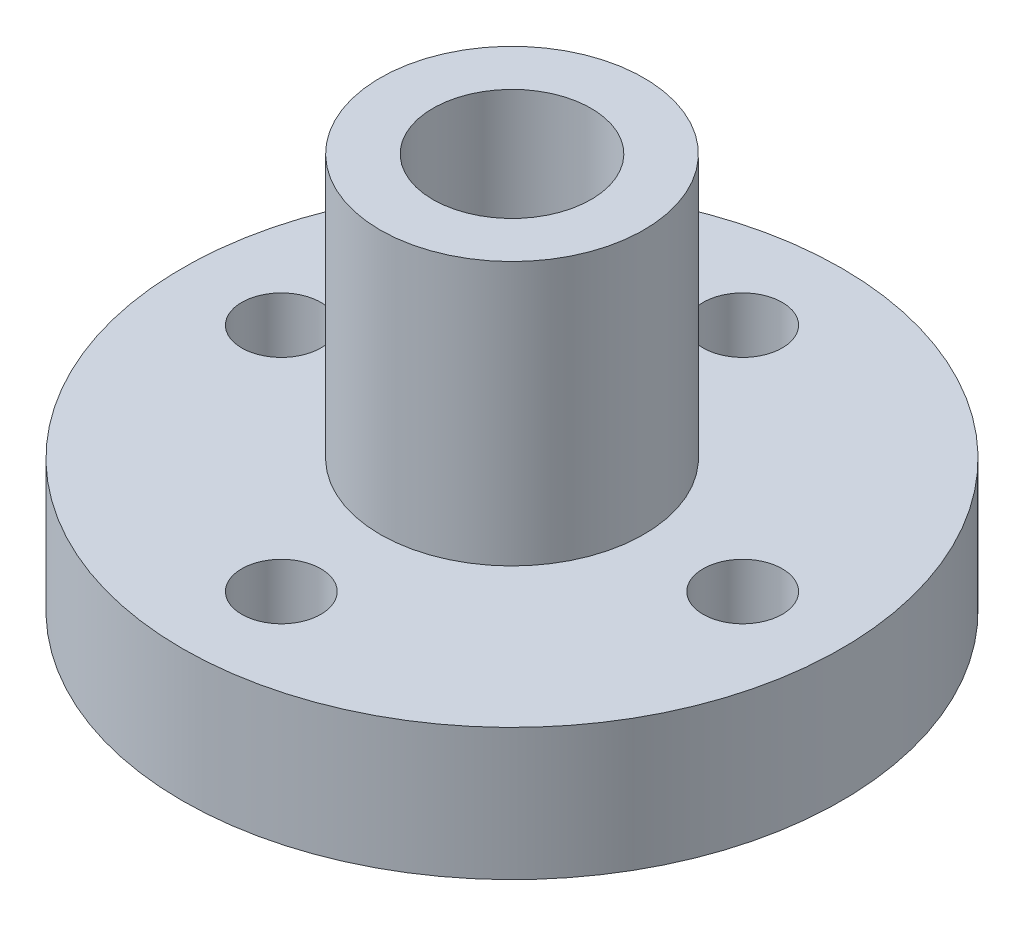
ISO-10303-21;
HEADER;
FILE_DESCRIPTION(('STEP AP214'),'2;1');
FILE_NAME('part.step','',(''),(''),'','','');
FILE_SCHEMA(('AUTOMOTIVE_DESIGN { 1 0 10303 214 1 1 1 1 }'));
ENDSEC;
DATA;
#1=APPLICATION_CONTEXT('core data for automotive mechanical design processes');
#2=APPLICATION_PROTOCOL_DEFINITION('international standard','automotive_design',2000,#1);
#3=PRODUCT_CONTEXT('',#1,'mechanical');
#4=PRODUCT('Part','Part','',(#3));
#5=PRODUCT_RELATED_PRODUCT_CATEGORY('part','',(#4));
#6=PRODUCT_DEFINITION_FORMATION('','',#4);
#7=PRODUCT_DEFINITION_CONTEXT('part definition',#1,'design');
#8=PRODUCT_DEFINITION('design','',#6,#7);
#9=PRODUCT_DEFINITION_SHAPE('','',#8);
#10=(LENGTH_UNIT() NAMED_UNIT(*) SI_UNIT(.MILLI.,.METRE.));
#11=(NAMED_UNIT(*) PLANE_ANGLE_UNIT() SI_UNIT($,.RADIAN.));
#12=(NAMED_UNIT(*) SI_UNIT($,.STERADIAN.) SOLID_ANGLE_UNIT());
#13=UNCERTAINTY_MEASURE_WITH_UNIT(LENGTH_MEASURE(1.E-05),#10,'distance_accuracy_value','');
#14=(GEOMETRIC_REPRESENTATION_CONTEXT(3) GLOBAL_UNCERTAINTY_ASSIGNED_CONTEXT((#13)) GLOBAL_UNIT_ASSIGNED_CONTEXT((#10,
#11,#12)) REPRESENTATION_CONTEXT('',''));
#15=CARTESIAN_POINT('',(0.,0.,0.));
#16=DIRECTION('',(0.,0.,1.));
#17=DIRECTION('',(1.,0.,0.));
#18=AXIS2_PLACEMENT_3D('',#15,#16,#17);
#19=CARTESIAN_POINT('',(0.,-10.,0.));
#20=DIRECTION('',(0.,1.,0.));
#21=DIRECTION('',(0.,0.,1.));
#22=AXIS2_PLACEMENT_3D('',#19,#20,#21);
#23=CYLINDRICAL_SURFACE('',#22,5.);
#24=CARTESIAN_POINT('',(-1.5,-5.,-4.76969600708473));
#25=CARTESIAN_POINT('',(-1.49999897633764,-4.9178054520576,-4.7696968572698));
#26=CARTESIAN_POINT('',(-1.49322108167142,-4.83560077585598,-4.77184390209069));
#27=CARTESIAN_POINT('',(-1.46635844446749,-4.67359475040806,-4.780165783029));
#28=CARTESIAN_POINT('',(-1.44626925573578,-4.59379421349854,-4.78634196493468));
#29=CARTESIAN_POINT('',(-1.39352753269955,-4.43896527172827,-4.80196102485633));
#30=CARTESIAN_POINT('',(-1.36089589394243,-4.36392917036691,-4.81139846703232));
#31=CARTESIAN_POINT('',(-1.28406421917929,-4.2203780660047,-4.83246932547567));
#32=CARTESIAN_POINT('',(-1.23986245137053,-4.15186404131556,-4.8441030704102));
#33=CARTESIAN_POINT('',(-1.13964754141627,-4.02113360942262,-4.86866862185766));
#34=CARTESIAN_POINT('',(-1.08333207175807,-3.95915410205371,-4.88162808311636));
#35=CARTESIAN_POINT('',(-0.961136237579598,-3.84536204867749,-4.90714861936757));
#36=CARTESIAN_POINT('',(-0.895254645461111,-3.79355080955012,-4.91970964297705));
#37=CARTESIAN_POINT('',(-0.75411143779369,-3.70053730016669,-4.94333214579389));
#38=CARTESIAN_POINT('',(-0.678684021335814,-3.65957657555719,-4.95435724342404));
#39=CARTESIAN_POINT('',(-0.521624645369353,-3.59101274095724,-4.97334435920684));
#40=CARTESIAN_POINT('',(-0.439994028387911,-3.56340675014255,-4.98130703789495));
#41=CARTESIAN_POINT('',(-0.275323852630829,-3.52311999890949,-4.99307646003589));
#42=CARTESIAN_POINT('',(-0.1923913989538,-3.5100348723473,-4.99699557369338));
#43=CARTESIAN_POINT('',(-0.0254218237493143,-3.49788267535356,-5.00063201501348));
#44=CARTESIAN_POINT('',(0.058615062050369,-3.49881266059804,-5.00035022521079));
#45=CARTESIAN_POINT('',(0.222571156600161,-3.51439286854302,-4.99569603817659));
#46=CARTESIAN_POINT('',(0.302536267641342,-3.52860519380987,-4.9914542020526));
#47=CARTESIAN_POINT('',(0.458889213442527,-3.56963133599429,-4.97951522112593));
#48=CARTESIAN_POINT('',(0.535276821322847,-3.59644595094267,-4.97181785750586));
#49=CARTESIAN_POINT('',(0.683347326351281,-3.66221202341856,-4.95365220986963));
#50=CARTESIAN_POINT('',(0.754965064694478,-3.70130120280727,-4.94315269676706));
#51=CARTESIAN_POINT('',(0.890764673783156,-3.79039785242823,-4.92049640648069));
#52=CARTESIAN_POINT('',(0.954944774872131,-3.84040791296348,-4.90833923637778));
#53=CARTESIAN_POINT('',(1.0766604815298,-3.9521977507516,-4.88311550488165));
#54=CARTESIAN_POINT('',(1.13384458040111,-4.01435691902974,-4.87003195321461));
#55=CARTESIAN_POINT('',(1.23707651539824,-4.14751001789005,-4.84483979887497));
#56=CARTESIAN_POINT('',(1.28312324482853,-4.21850482538923,-4.8327312931702));
#57=CARTESIAN_POINT('',(1.3631399533545,-4.36823946924899,-4.81077903197678));
#58=CARTESIAN_POINT('',(1.39698989237679,-4.44704704586292,-4.80095810695957));
#59=CARTESIAN_POINT('',(1.45083362878413,-4.60960720844554,-4.78496392548436));
#60=CARTESIAN_POINT('',(1.4708319464056,-4.69335817153456,-4.7787894791583));
#61=CARTESIAN_POINT('',(1.49574770282165,-4.86008236073928,-4.77104849541241));
#62=CARTESIAN_POINT('',(1.50119946380212,-4.94296822389398,-4.7693187867044));
#63=CARTESIAN_POINT('',(1.49835947233062,-5.10847290000987,-4.77021192441924));
#64=CARTESIAN_POINT('',(1.4900696437133,-5.19109174873085,-4.77283416156589));
#65=CARTESIAN_POINT('',(1.4604576357419,-5.35148837797087,-4.78197558554912));
#66=CARTESIAN_POINT('',(1.4394796143128,-5.42933616426352,-4.78839176507489));
#67=CARTESIAN_POINT('',(1.3854857774794,-5.58040169081492,-4.80429141231227));
#68=CARTESIAN_POINT('',(1.3524681034276,-5.65361871414057,-4.81377535359073));
#69=CARTESIAN_POINT('',(1.274318711965,-5.79551746407213,-4.83505835023047));
#70=CARTESIAN_POINT('',(1.22888564172729,-5.86402472098579,-4.84691271069799));
#71=CARTESIAN_POINT('',(1.12755301600385,-5.9926381061808,-4.87148205646987));
#72=CARTESIAN_POINT('',(1.07165095534897,-6.05274221761279,-4.88419724730003));
#73=CARTESIAN_POINT('',(0.948455132493598,-6.16518040581474,-4.90963633548158));
#74=CARTESIAN_POINT('',(0.880811065857434,-6.21713562898698,-4.92234245063004));
#75=CARTESIAN_POINT('',(0.737461784590249,-6.30896670102775,-4.94584851748651));
#76=CARTESIAN_POINT('',(0.661756970543943,-6.34884314978146,-4.95664856384717));
#77=CARTESIAN_POINT('',(0.504935504705221,-6.4150000305683,-4.97505970474957));
#78=CARTESIAN_POINT('',(0.423864622037838,-6.44138201615898,-4.98269453424966));
#79=CARTESIAN_POINT('',(0.258169966504588,-6.48006091889042,-4.99401979596827));
#80=CARTESIAN_POINT('',(0.173547217354763,-6.49236186594842,-4.9977113567088));
#81=CARTESIAN_POINT('',(0.006652153882743,-6.5022230440545,-5.00066544081399));
#82=CARTESIAN_POINT('',(-0.0755851790862064,-6.50033269540783,-5.00009305111322));
#83=CARTESIAN_POINT('',(-0.238519481164404,-6.48317836750088,-4.99497264465037));
#84=CARTESIAN_POINT('',(-0.319216537346528,-6.46791514651956,-4.99042485330462));
#85=CARTESIAN_POINT('',(-0.475935813041358,-6.42478833860037,-4.97791168358327));
#86=CARTESIAN_POINT('',(-0.551998927351392,-6.39706181935099,-4.96998352900866));
#87=CARTESIAN_POINT('',(-0.698433237752053,-6.32991808549281,-4.9515294303945));
#88=CARTESIAN_POINT('',(-0.768803496050579,-6.29049894971381,-4.94100305949946));
#89=CARTESIAN_POINT('',(-0.904301892420563,-6.19962654256997,-4.91803965828228));
#90=CARTESIAN_POINT('',(-0.969190250076767,-6.14782856999923,-4.90555226923559));
#91=CARTESIAN_POINT('',(-1.08953757134594,-6.0342896116672,-4.88023537212334));
#92=CARTESIAN_POINT('',(-1.14499380960194,-5.97254576210185,-4.86740576641079));
#93=CARTESIAN_POINT('',(-1.24656269394549,-5.83865922168949,-4.84240680631319));
#94=CARTESIAN_POINT('',(-1.29234759757956,-5.76626144660956,-4.83026852693485));
#95=CARTESIAN_POINT('',(-1.37104313528776,-5.61444482583898,-4.80852547508793));
#96=CARTESIAN_POINT('',(-1.40395995557289,-5.53502937639881,-4.79891948596956));
#97=CARTESIAN_POINT('',(-1.4530194253295,-5.38025956839373,-4.78427816717594));
#98=CARTESIAN_POINT('',(-1.47058859011232,-5.30539135306901,-4.7788615484052));
#99=CARTESIAN_POINT('',(-1.49407818835144,-5.15368477750423,-4.77157042597167));
#100=CARTESIAN_POINT('',(-1.50000095706095,-5.07684681535475,-4.7696952122143));
#101=CARTESIAN_POINT('',(-1.5,-5.,-4.76969600708473));
#102=B_SPLINE_CURVE_WITH_KNOTS('',3,(#24,#25,#26,#27,#28,#29,#30,#31,#32,#33,#34,#35,#36,#37,
#38,#39,#40,#41,#42,#43,#44,#45,#46,#47,#48,#49,#50,#51,#52,#53,#54,#55,#56,#57,#58,#59,#60,#61,
#62,#63,#64,#65,#66,#67,#68,#69,#70,#71,#72,#73,#74,#75,#76,#77,#78,#79,#80,#81,#82,#83,#84,#85,
#86,#87,#88,#89,#90,#91,#92,#93,#94,#95,#96,#97,#98,#99,#100,#101),.UNSPECIFIED.,.T.,.F.,(4,2,2,
2,2,2,2,2,2,2,2,2,2,2,2,2,2,2,2,2,2,2,2,2,2,2,2,2,2,2,2,2,2,2,2,2,2,2,4),(0.,0.246300165915543,
0.492682641689,0.738656414466193,0.984667025370102,1.23773150007984,1.49082847871273,
1.74915939273645,2.00743455587877,2.25832140149558,2.5091555410144,2.7520012599088,
2.99486235890376,3.24055209335676,3.48630016590831,3.74152147023278,3.99676812491863,
4.25446238246266,4.51207250628411,4.76008080790309,5.00805439107388,5.24958594938817,
5.49115481045787,5.73920731809388,5.98731925928923,6.24479506100602,6.50225807324202,
6.75775391814325,7.01317662321682,7.2587630391122,7.50433553047755,7.74727096872219,
7.99024634491378,8.24099627054488,8.49181852629891,8.75011639669147,9.00828993963944,
9.23861153857448,9.46888695033561),.UNSPECIFIED.);
#103=CARTESIAN_POINT('',(-1.5,-5.,-4.76969600708473));
#104=VERTEX_POINT('',#103);
#105=EDGE_CURVE('E76',#104,#104,#102,.T.);
#106=ORIENTED_EDGE('',*,*,#105,.F.);
#107=EDGE_LOOP('',(#106));
#108=FACE_BOUND('',#107,.T.);
#109=CARTESIAN_POINT('',(0.,-10.,0.));
#110=DIRECTION('',(0.,1.,0.));
#111=DIRECTION('',(0.,0.,1.));
#112=AXIS2_PLACEMENT_3D('',#109,#110,#111);
#113=CIRCLE('',#112,5.);
#114=CARTESIAN_POINT('',(0.,-10.,5.));
#115=VERTEX_POINT('',#114);
#116=EDGE_CURVE('E56',#115,#115,#113,.T.);
#117=ORIENTED_EDGE('',*,*,#116,.T.);
#118=EDGE_LOOP('',(#117));
#119=FACE_BOUND('',#118,.T.);
#120=CARTESIAN_POINT('',(0.,0.,0.));
#121=DIRECTION('',(0.,1.,0.));
#122=DIRECTION('',(0.,0.,1.));
#123=AXIS2_PLACEMENT_3D('',#120,#121,#122);
#124=CIRCLE('',#123,5.);
#125=CARTESIAN_POINT('',(0.,0.,5.));
#126=VERTEX_POINT('',#125);
#127=EDGE_CURVE('E10',#126,#126,#124,.T.);
#128=ORIENTED_EDGE('',*,*,#127,.F.);
#129=EDGE_LOOP('',(#128));
#130=FACE_BOUND('',#129,.T.);
#131=ADVANCED_FACE('F37',(#108,#119,#130),#23,.T.);
#132=CARTESIAN_POINT('',(0.,0.,0.));
#133=DIRECTION('',(0.,1.,0.));
#134=DIRECTION('',(0.,0.,1.));
#135=AXIS2_PLACEMENT_3D('',#132,#133,#134);
#136=PLANE('',#135);
#137=CARTESIAN_POINT('',(0.,0.,0.));
#138=DIRECTION('',(0.,1.,0.));
#139=DIRECTION('',(0.,0.,1.));
#140=AXIS2_PLACEMENT_3D('',#137,#138,#139);
#141=CIRCLE('',#140,3.);
#142=CARTESIAN_POINT('',(0.,0.,3.));
#143=VERTEX_POINT('',#142);
#144=EDGE_CURVE('E51',#143,#143,#141,.T.);
#145=ORIENTED_EDGE('',*,*,#144,.F.);
#146=EDGE_LOOP('',(#145));
#147=FACE_BOUND('',#146,.T.);
#148=ORIENTED_EDGE('',*,*,#127,.T.);
#149=EDGE_LOOP('',(#148));
#150=FACE_BOUND('',#149,.T.);
#151=ADVANCED_FACE('F146',(#147,#150),#136,.T.);
#152=CARTESIAN_POINT('',(0.,-10.,0.));
#153=DIRECTION('',(0.,1.,0.));
#154=DIRECTION('',(0.,0.,1.));
#155=AXIS2_PLACEMENT_3D('',#152,#153,#154);
#156=CYLINDRICAL_SURFACE('',#155,3.);
#157=CARTESIAN_POINT('',(-1.5,-5.,-2.59807621135332));
#158=CARTESIAN_POINT('',(-1.4999945446118,-4.92183828770712,-2.59808302092689));
#159=CARTESIAN_POINT('',(-1.49384995609983,-4.84357788271243,-2.60165701781635));
#160=CARTESIAN_POINT('',(-1.46958481484708,-4.68945910298427,-2.61543549678079));
#161=CARTESIAN_POINT('',(-1.45143909683127,-4.61360612743489,-2.62565391083339));
#162=CARTESIAN_POINT('',(-1.40414992304972,-4.46682250348409,-2.65124019908098));
#163=CARTESIAN_POINT('',(-1.3750649287406,-4.39586802128962,-2.66658065209878));
#164=CARTESIAN_POINT('',(-1.30690128806456,-4.25986369700492,-2.70063997225287));
#165=CARTESIAN_POINT('',(-1.26782210105366,-4.19481417460631,-2.71935902214097));
#166=CARTESIAN_POINT('',(-1.17699981079632,-4.06654140716374,-2.75995303586162));
#167=CARTESIAN_POINT('',(-1.12447805421566,-4.00391129648968,-2.7819609545693));
#168=CARTESIAN_POINT('',(-1.0098807114217,-3.88788741738994,-2.82557974178559));
#169=CARTESIAN_POINT('',(-0.947800388673439,-3.83449825612472,-2.84719040746875));
#170=CARTESIAN_POINT('',(-0.810734345121819,-3.73494927327851,-2.88932215429424));
#171=CARTESIAN_POINT('',(-0.735160783518862,-3.6895193482107,-2.90967159627259));
#172=CARTESIAN_POINT('',(-0.576235539899255,-3.61228872013136,-2.94526134149294));
#173=CARTESIAN_POINT('',(-0.492888807207232,-3.58047941579424,-2.96050486775612));
#174=CARTESIAN_POINT('',(-0.327067415888965,-3.53374300804835,-2.98320691866356));
#175=CARTESIAN_POINT('',(-0.244952685733226,-3.5177757104667,-2.99114220331338));
#176=CARTESIAN_POINT('',(-0.0788559430467718,-3.49975082198744,-3.00011375769101));
#177=CARTESIAN_POINT('',(0.00512490876560814,-3.49768481480643,-3.00115420176885));
#178=CARTESIAN_POINT('',(0.164748786635625,-3.50712001095552,-2.99644472874675));
#179=CARTESIAN_POINT('',(0.240481798765188,-3.51745702328183,-2.99127743838241));
#180=CARTESIAN_POINT('',(0.388970657877483,-3.54932126585699,-2.97561367889621));
#181=CARTESIAN_POINT('',(0.461726281640889,-3.57084933346433,-2.96511681099591));
#182=CARTESIAN_POINT('',(0.603464087354331,-3.62462384913472,-2.93957374931482));
#183=CARTESIAN_POINT('',(0.672380135272768,-3.6570144697581,-2.92446662293799));
#184=CARTESIAN_POINT('',(0.803965202269993,-3.73139512430224,-2.89106468980031));
#185=CARTESIAN_POINT('',(0.866631973257969,-3.77338859495352,-2.87276874236226));
#186=CARTESIAN_POINT('',(0.990260491347293,-3.87034302729952,-2.83266591598844));
#187=CARTESIAN_POINT('',(1.05050111254404,-3.92615454248902,-2.81069063997263));
#188=CARTESIAN_POINT('',(1.16115655544667,-4.04688458739527,-2.76681510880218));
#189=CARTESIAN_POINT('',(1.21156381736135,-4.11181005841109,-2.74491492398443));
#190=CARTESIAN_POINT('',(1.30425800196332,-4.25397228863613,-2.70216234138727));
#191=CARTESIAN_POINT('',(1.34582597246708,-4.33172903458132,-2.68146479986061));
#192=CARTESIAN_POINT('',(1.41497866950185,-4.4944065070385,-2.64563175417864));
#193=CARTESIAN_POINT('',(1.44257798731633,-4.57931964952634,-2.63049045069101));
#194=CARTESIAN_POINT('',(1.48077031653756,-4.74682176692419,-2.60916953725552));
#195=CARTESIAN_POINT('',(1.49253768317996,-4.82906167856533,-2.60237483772745));
#196=CARTESIAN_POINT('',(1.50227541991714,-4.99460201227481,-2.59676879042414));
#197=CARTESIAN_POINT('',(1.50025553597254,-5.07790164367968,-2.59795180333967));
#198=CARTESIAN_POINT('',(1.48355406501595,-5.23348087786809,-2.60751504810877));
#199=CARTESIAN_POINT('',(1.4702817250687,-5.30596917666189,-2.61509381259981));
#200=CARTESIAN_POINT('',(1.43354442694866,-5.44755167940644,-2.63541032327012));
#201=CARTESIAN_POINT('',(1.41007616793542,-5.51664477611991,-2.64814974007551));
#202=CARTESIAN_POINT('',(1.35247138290733,-5.65311699635405,-2.67804333119485));
#203=CARTESIAN_POINT('',(1.31789109553908,-5.72026852528033,-2.69537464864595));
#204=CARTESIAN_POINT('',(1.23943059602371,-5.84820390730849,-2.73234179245875));
#205=CARTESIAN_POINT('',(1.19554560649832,-5.90898446526993,-2.75197880032721));
#206=CARTESIAN_POINT('',(1.09325575079828,-6.03046815128532,-2.79431997684504));
#207=CARTESIAN_POINT('',(1.03371790847245,-6.09019572607649,-2.81709874731434));
#208=CARTESIAN_POINT('',(0.905106743097433,-6.19911835699039,-2.86101352466839));
#209=CARTESIAN_POINT('',(0.836030211983021,-6.24830985534581,-2.88214897511564));
#210=CARTESIAN_POINT('',(0.687803043838135,-6.33586058892515,-2.92112042536435));
#211=CARTESIAN_POINT('',(0.608434646361169,-6.37389967731637,-2.93885462508044));
#212=CARTESIAN_POINT('',(0.443283546961622,-6.43570685578609,-2.96825032438952));
#213=CARTESIAN_POINT('',(0.357506552088263,-6.45948747704946,-2.9799171551456));
#214=CARTESIAN_POINT('',(0.190469523495625,-6.49005284626199,-2.99501262272824));
#215=CARTESIAN_POINT('',(0.109517165775685,-6.49819681381417,-2.99909891862287));
#216=CARTESIAN_POINT('',(-0.0526889789268061,-6.5012648981816,-3.00063195562697));
#217=CARTESIAN_POINT('',(-0.133942650442631,-6.49619364278535,-2.99808102100335));
#218=CARTESIAN_POINT('',(-0.288806988475721,-6.47387538980656,-2.98700953256884));
#219=CARTESIAN_POINT('',(-0.362568476716896,-6.45745272611349,-2.97889342001985));
#220=CARTESIAN_POINT('',(-0.506168928275427,-6.41400950104554,-2.95788140495135));
#221=CARTESIAN_POINT('',(-0.576007327433264,-6.38698741985982,-2.94498481699194));
#222=CARTESIAN_POINT('',(-0.713135109367328,-6.32190942175104,-2.9148889612218));
#223=CARTESIAN_POINT('',(-0.780187714050071,-6.28343101518824,-2.89752925798199));
#224=CARTESIAN_POINT('',(-0.907161962721038,-6.19706310371142,-2.86032199712739));
#225=CARTESIAN_POINT('',(-0.967080311122362,-6.14916927632649,-2.84047329837541));
#226=CARTESIAN_POINT('',(-1.08437100623534,-6.03980429146595,-2.79792915339941));
#227=CARTESIAN_POINT('',(-1.14089652680891,-5.97745626878421,-2.77514698517547));
#228=CARTESIAN_POINT('',(-1.24299493109201,-5.84382391830535,-2.73094614244278));
#229=CARTESIAN_POINT('',(-1.28855812501509,-5.77253176869847,-2.70952868642798));
#230=CARTESIAN_POINT('',(-1.36864661967848,-5.62004503012857,-2.66999407957374));
#231=CARTESIAN_POINT('',(-1.40277759894141,-5.5386087033069,-2.65200261384405));
#232=CARTESIAN_POINT('',(-1.45631806425962,-5.37000139349033,-2.62299234492527));
#233=CARTESIAN_POINT('',(-1.47577678676302,-5.28285066663097,-2.61195024221553));
#234=CARTESIAN_POINT('',(-1.49155051179662,-5.16229196652201,-2.60293908902686));
#235=CARTESIAN_POINT('',(-1.49471415744578,-5.12994815840318,-2.60112193507728));
#236=CARTESIAN_POINT('',(-1.49894010763494,-5.06507527897664,-2.59868903831625));
#237=CARTESIAN_POINT('',(-1.50000227159981,-5.03254619542119,-2.59807337587664));
#238=CARTESIAN_POINT('',(-1.5,-5.,-2.59807621135332));
#239=B_SPLINE_CURVE_WITH_KNOTS('',3,(#157,#158,#159,#160,#161,#162,#163,#164,#165,#166,#167,
#168,#169,#170,#171,#172,#173,#174,#175,#176,#177,#178,#179,#180,#181,#182,#183,#184,#185,#186,
#187,#188,#189,#190,#191,#192,#193,#194,#195,#196,#197,#198,#199,#200,#201,#202,#203,#204,#205,
#206,#207,#208,#209,#210,#211,#212,#213,#214,#215,#216,#217,#218,#219,#220,#221,#222,#223,#224,
#225,#226,#227,#228,#229,#230,#231,#232,#233,#234,#235,#236,#237,#238),.UNSPECIFIED.,.T.,.F.,(4,
2,2,2,2,2,2,2,2,2,2,2,2,2,2,2,2,2,2,2,2,2,2,2,2,2,2,2,2,2,2,2,2,2,2,2,2,2,2,2,4),(0.,
0.234348183892072,0.469189339237207,0.702792893878329,0.936409088167725,1.18929346874735,
1.44230356626557,1.71236838358145,1.98226240445837,2.23295227451903,2.4834903552906,
2.71224146226808,2.94100968776183,3.1729430209672,3.40495949025408,3.65890787185336,
3.91305072368878,4.18333262594173,4.45333161317557,4.70193436281318,4.9503613978256,
5.17161275136038,5.39293578654095,5.62450944609132,5.85620229330071,6.1171011537092,
6.37808797467303,6.64596272119449,6.91360169713157,7.1566840558423,7.39968130190958,
7.62666637307239,7.8536840026802,8.09041126079208,8.32724745151079,8.58765362775101,
8.84828914267731,9.11716123557907,9.3851269950414,9.48270202777964,9.58028358741811),.UNSPECIFIED.);
#240=CARTESIAN_POINT('',(-1.5,-5.,-2.59807621135332));
#241=VERTEX_POINT('',#240);
#242=EDGE_CURVE('E41',#241,#241,#239,.T.);
#243=ORIENTED_EDGE('',*,*,#242,.T.);
#244=EDGE_LOOP('',(#243));
#245=FACE_BOUND('',#244,.T.);
#246=ORIENTED_EDGE('',*,*,#144,.T.);
#247=EDGE_LOOP('',(#246));
#248=FACE_BOUND('',#247,.T.);
#249=CARTESIAN_POINT('',(0.,-15.,0.));
#250=DIRECTION('',(0.,1.,0.));
#251=DIRECTION('',(0.,0.,1.));
#252=AXIS2_PLACEMENT_3D('',#249,#250,#251);
#253=CIRCLE('',#252,3.);
#254=CARTESIAN_POINT('',(0.,-15.,3.));
#255=VERTEX_POINT('',#254);
#256=EDGE_CURVE('E109',#255,#255,#253,.T.);
#257=ORIENTED_EDGE('',*,*,#256,.F.);
#258=EDGE_LOOP('',(#257));
#259=FACE_BOUND('',#258,.T.);
#260=ADVANCED_FACE('F140',(#245,#248,#259),#156,.F.);
#261=CARTESIAN_POINT('',(0.,-10.,0.));
#262=DIRECTION('',(0.,-1.,0.));
#263=DIRECTION('',(0.,0.,-1.));
#264=AXIS2_PLACEMENT_3D('',#261,#262,#263);
#265=PLANE('',#264);
#266=CARTESIAN_POINT('',(0.,-10.,-8.75));
#267=DIRECTION('',(0.,1.,0.));
#268=DIRECTION('',(0.,0.,1.));
#269=AXIS2_PLACEMENT_3D('',#266,#267,#268);
#270=CIRCLE('',#269,1.5);
#271=CARTESIAN_POINT('',(0.,-10.,-7.25));
#272=VERTEX_POINT('',#271);
#273=EDGE_CURVE('E96',#272,#272,#270,.T.);
#274=ORIENTED_EDGE('',*,*,#273,.F.);
#275=EDGE_LOOP('',(#274));
#276=FACE_BOUND('',#275,.T.);
#277=CARTESIAN_POINT('',(8.75,-10.,0.));
#278=DIRECTION('',(0.,1.,0.));
#279=DIRECTION('',(0.,0.,1.));
#280=AXIS2_PLACEMENT_3D('',#277,#278,#279);
#281=CIRCLE('',#280,1.5);
#282=CARTESIAN_POINT('',(8.75,-10.,1.50000000000003));
#283=VERTEX_POINT('',#282);
#284=EDGE_CURVE('E88',#283,#283,#281,.T.);
#285=ORIENTED_EDGE('',*,*,#284,.F.);
#286=EDGE_LOOP('',(#285));
#287=FACE_BOUND('',#286,.T.);
#288=CARTESIAN_POINT('',(0.,-10.,8.75));
#289=DIRECTION('',(0.,1.,0.));
#290=DIRECTION('',(0.,0.,1.));
#291=AXIS2_PLACEMENT_3D('',#288,#289,#290);
#292=CIRCLE('',#291,1.5);
#293=CARTESIAN_POINT('',(0.,-10.,10.25));
#294=VERTEX_POINT('',#293);
#295=EDGE_CURVE('E80',#294,#294,#292,.T.);
#296=ORIENTED_EDGE('',*,*,#295,.F.);
#297=EDGE_LOOP('',(#296));
#298=FACE_BOUND('',#297,.T.);
#299=CARTESIAN_POINT('',(-8.75,-10.,0.));
#300=DIRECTION('',(0.,1.,0.));
#301=DIRECTION('',(0.,0.,1.));
#302=AXIS2_PLACEMENT_3D('',#299,#300,#301);
#303=CIRCLE('',#302,1.5);
#304=CARTESIAN_POINT('',(-8.75,-10.,1.49999999999991));
#305=VERTEX_POINT('',#304);
#306=EDGE_CURVE('E71',#305,#305,#303,.T.);
#307=ORIENTED_EDGE('',*,*,#306,.F.);
#308=EDGE_LOOP('',(#307));
#309=FACE_BOUND('',#308,.T.);
#310=ORIENTED_EDGE('',*,*,#116,.F.);
#311=EDGE_LOOP('',(#310));
#312=FACE_BOUND('',#311,.T.);
#313=CARTESIAN_POINT('',(0.,-10.,0.));
#314=DIRECTION('',(0.,-1.,0.));
#315=DIRECTION('',(0.,0.,-1.));
#316=AXIS2_PLACEMENT_3D('',#313,#314,#315);
#317=CIRCLE('',#316,12.5);
#318=CARTESIAN_POINT('',(0.,-10.,-12.5));
#319=VERTEX_POINT('',#318);
#320=EDGE_CURVE('E63',#319,#319,#317,.T.);
#321=ORIENTED_EDGE('',*,*,#320,.F.);
#322=EDGE_LOOP('',(#321));
#323=FACE_BOUND('',#322,.T.);
#324=ADVANCED_FACE('F136',(#276,#287,#298,#309,#312,#323),#265,.F.);
#325=CARTESIAN_POINT('',(0.,-15.,0.));
#326=DIRECTION('',(0.,-1.,0.));
#327=DIRECTION('',(0.,0.,-1.));
#328=AXIS2_PLACEMENT_3D('',#325,#326,#327);
#329=PLANE('',#328);
#330=ORIENTED_EDGE('',*,*,#256,.T.);
#331=EDGE_LOOP('',(#330));
#332=FACE_BOUND('',#331,.T.);
#333=CARTESIAN_POINT('',(0.,-15.,-8.75));
#334=DIRECTION('',(0.,1.,0.));
#335=DIRECTION('',(0.,0.,1.));
#336=AXIS2_PLACEMENT_3D('',#333,#334,#335);
#337=CIRCLE('',#336,1.5);
#338=CARTESIAN_POINT('',(0.,-15.,-7.25));
#339=VERTEX_POINT('',#338);
#340=EDGE_CURVE('E67',#339,#339,#337,.T.);
#341=ORIENTED_EDGE('',*,*,#340,.T.);
#342=EDGE_LOOP('',(#341));
#343=FACE_BOUND('',#342,.T.);
#344=CARTESIAN_POINT('',(8.75,-15.,0.));
#345=DIRECTION('',(0.,1.,0.));
#346=DIRECTION('',(0.,0.,1.));
#347=AXIS2_PLACEMENT_3D('',#344,#345,#346);
#348=CIRCLE('',#347,1.5);
#349=CARTESIAN_POINT('',(8.75,-15.,1.50000000000003));
#350=VERTEX_POINT('',#349);
#351=EDGE_CURVE('E92',#350,#350,#348,.T.);
#352=ORIENTED_EDGE('',*,*,#351,.T.);
#353=EDGE_LOOP('',(#352));
#354=FACE_BOUND('',#353,.T.);
#355=CARTESIAN_POINT('',(0.,-15.,8.75));
#356=DIRECTION('',(0.,1.,0.));
#357=DIRECTION('',(0.,0.,1.));
#358=AXIS2_PLACEMENT_3D('',#355,#356,#357);
#359=CIRCLE('',#358,1.5);
#360=CARTESIAN_POINT('',(0.,-15.,10.25));
#361=VERTEX_POINT('',#360);
#362=EDGE_CURVE('E84',#361,#361,#359,.T.);
#363=ORIENTED_EDGE('',*,*,#362,.T.);
#364=EDGE_LOOP('',(#363));
#365=FACE_BOUND('',#364,.T.);
#366=CARTESIAN_POINT('',(-8.75,-15.,0.));
#367=DIRECTION('',(0.,1.,0.));
#368=DIRECTION('',(0.,0.,1.));
#369=AXIS2_PLACEMENT_3D('',#366,#367,#368);
#370=CIRCLE('',#369,1.5);
#371=CARTESIAN_POINT('',(-8.75,-15.,1.49999999999991));
#372=VERTEX_POINT('',#371);
#373=EDGE_CURVE('E75',#372,#372,#370,.T.);
#374=ORIENTED_EDGE('',*,*,#373,.T.);
#375=EDGE_LOOP('',(#374));
#376=FACE_BOUND('',#375,.T.);
#377=CARTESIAN_POINT('',(0.,-15.,0.));
#378=DIRECTION('',(0.,-1.,0.));
#379=DIRECTION('',(0.,0.,-1.));
#380=AXIS2_PLACEMENT_3D('',#377,#378,#379);
#381=CIRCLE('',#380,12.5);
#382=CARTESIAN_POINT('',(0.,-15.,-12.5));
#383=VERTEX_POINT('',#382);
#384=EDGE_CURVE('E61',#383,#383,#381,.T.);
#385=ORIENTED_EDGE('',*,*,#384,.T.);
#386=EDGE_LOOP('',(#385));
#387=FACE_BOUND('',#386,.T.);
#388=ADVANCED_FACE('F133',(#332,#343,#354,#365,#376,#387),#329,.T.);
#389=CARTESIAN_POINT('',(0.,-15.,0.));
#390=DIRECTION('',(0.,1.,0.));
#391=DIRECTION('',(0.,0.,1.));
#392=AXIS2_PLACEMENT_3D('',#389,#390,#391);
#393=CYLINDRICAL_SURFACE('',#392,12.5);
#394=ORIENTED_EDGE('',*,*,#384,.F.);
#395=EDGE_LOOP('',(#394));
#396=FACE_BOUND('',#395,.T.);
#397=ORIENTED_EDGE('',*,*,#320,.T.);
#398=EDGE_LOOP('',(#397));
#399=FACE_BOUND('',#398,.T.);
#400=ADVANCED_FACE('F131',(#396,#399),#393,.T.);
#401=CARTESIAN_POINT('',(-8.75,-15.,0.));
#402=DIRECTION('',(0.,1.,0.));
#403=DIRECTION('',(0.,0.,1.));
#404=AXIS2_PLACEMENT_3D('',#401,#402,#403);
#405=CYLINDRICAL_SURFACE('',#404,1.5);
#406=ORIENTED_EDGE('',*,*,#373,.F.);
#407=EDGE_LOOP('',(#406));
#408=FACE_BOUND('',#407,.T.);
#409=ORIENTED_EDGE('',*,*,#306,.T.);
#410=EDGE_LOOP('',(#409));
#411=FACE_BOUND('',#410,.T.);
#412=ADVANCED_FACE('F127',(#408,#411),#405,.F.);
#413=CARTESIAN_POINT('',(0.,-15.,8.75));
#414=DIRECTION('',(0.,1.,0.));
#415=DIRECTION('',(0.,0.,1.));
#416=AXIS2_PLACEMENT_3D('',#413,#414,#415);
#417=CYLINDRICAL_SURFACE('',#416,1.5);
#418=ORIENTED_EDGE('',*,*,#362,.F.);
#419=EDGE_LOOP('',(#418));
#420=FACE_BOUND('',#419,.T.);
#421=ORIENTED_EDGE('',*,*,#295,.T.);
#422=EDGE_LOOP('',(#421));
#423=FACE_BOUND('',#422,.T.);
#424=ADVANCED_FACE('F123',(#420,#423),#417,.F.);
#425=CARTESIAN_POINT('',(8.75,-15.,0.));
#426=DIRECTION('',(0.,1.,0.));
#427=DIRECTION('',(0.,0.,1.));
#428=AXIS2_PLACEMENT_3D('',#425,#426,#427);
#429=CYLINDRICAL_SURFACE('',#428,1.5);
#430=ORIENTED_EDGE('',*,*,#351,.F.);
#431=EDGE_LOOP('',(#430));
#432=FACE_BOUND('',#431,.T.);
#433=ORIENTED_EDGE('',*,*,#284,.T.);
#434=EDGE_LOOP('',(#433));
#435=FACE_BOUND('',#434,.T.);
#436=ADVANCED_FACE('F119',(#432,#435),#429,.F.);
#437=CARTESIAN_POINT('',(0.,-15.,-8.75));
#438=DIRECTION('',(0.,1.,0.));
#439=DIRECTION('',(0.,0.,1.));
#440=AXIS2_PLACEMENT_3D('',#437,#438,#439);
#441=CYLINDRICAL_SURFACE('',#440,1.5);
#442=ORIENTED_EDGE('',*,*,#340,.F.);
#443=EDGE_LOOP('',(#442));
#444=FACE_BOUND('',#443,.T.);
#445=ORIENTED_EDGE('',*,*,#273,.T.);
#446=EDGE_LOOP('',(#445));
#447=FACE_BOUND('',#446,.T.);
#448=ADVANCED_FACE('F114',(#444,#447),#441,.F.);
#449=CARTESIAN_POINT('',(0.,-5.,0.));
#450=DIRECTION('',(0.,0.,-1.));
#451=DIRECTION('',(-1.,0.,0.));
#452=AXIS2_PLACEMENT_3D('',#449,#450,#451);
#453=CYLINDRICAL_SURFACE('',#452,1.5);
#454=ORIENTED_EDGE('',*,*,#105,.T.);
#455=EDGE_LOOP('',(#454));
#456=FACE_BOUND('',#455,.T.);
#457=ORIENTED_EDGE('',*,*,#242,.F.);
#458=EDGE_LOOP('',(#457));
#459=FACE_BOUND('',#458,.T.);
#460=ADVANCED_FACE('F110',(#456,#459),#453,.F.);
#461=CLOSED_SHELL('',(#131,#151,#260,#324,#388,#400,#412,#424,#436,#448,#460));
#462=MANIFOLD_SOLID_BREP('B2',#461);
#463=ADVANCED_BREP_SHAPE_REPRESENTATION('',(#18,#462),#14);
#464=SHAPE_DEFINITION_REPRESENTATION(#9,#463);
ENDSEC;
END-ISO-10303-21;
